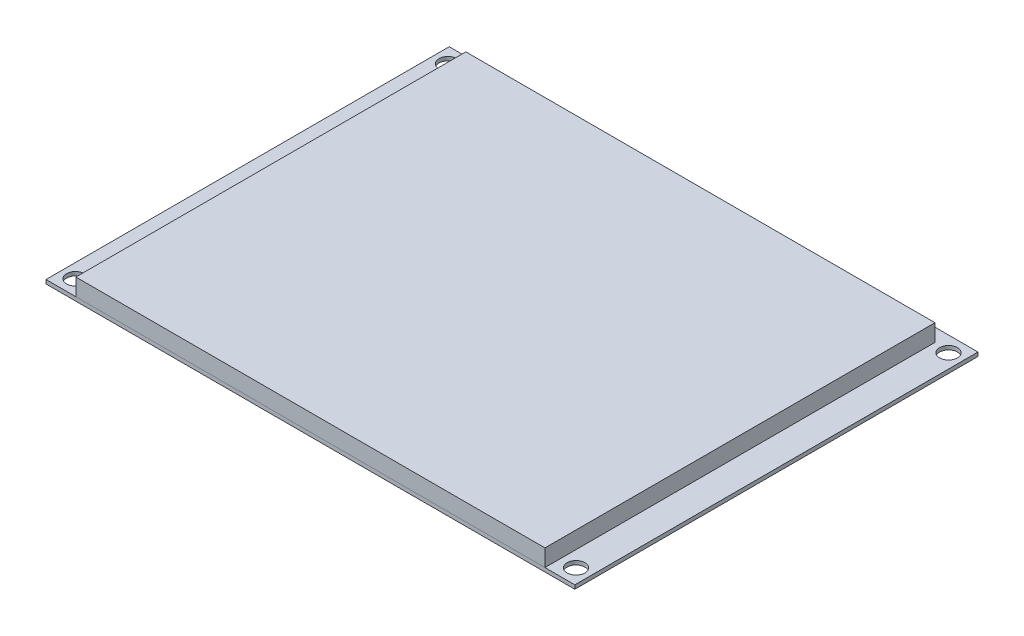
ISO-10303-21;
HEADER;
FILE_DESCRIPTION(('STEP AP214'),'2;1');
FILE_NAME('part.step','',(''),(''),'','','');
FILE_SCHEMA(('AUTOMOTIVE_DESIGN { 1 0 10303 214 1 1 1 1 }'));
ENDSEC;
DATA;
#1=APPLICATION_CONTEXT('core data for automotive mechanical design processes');
#2=APPLICATION_PROTOCOL_DEFINITION('international standard','automotive_design',2000,#1);
#3=PRODUCT_CONTEXT('',#1,'mechanical');
#4=PRODUCT('Part','Part','',(#3));
#5=PRODUCT_RELATED_PRODUCT_CATEGORY('part','',(#4));
#6=PRODUCT_DEFINITION_FORMATION('','',#4);
#7=PRODUCT_DEFINITION_CONTEXT('part definition',#1,'design');
#8=PRODUCT_DEFINITION('design','',#6,#7);
#9=PRODUCT_DEFINITION_SHAPE('','',#8);
#10=(LENGTH_UNIT() NAMED_UNIT(*) SI_UNIT(.MILLI.,.METRE.));
#11=(NAMED_UNIT(*) PLANE_ANGLE_UNIT() SI_UNIT($,.RADIAN.));
#12=(NAMED_UNIT(*) SI_UNIT($,.STERADIAN.) SOLID_ANGLE_UNIT());
#13=UNCERTAINTY_MEASURE_WITH_UNIT(LENGTH_MEASURE(1.E-05),#10,'distance_accuracy_value','');
#14=(GEOMETRIC_REPRESENTATION_CONTEXT(3) GLOBAL_UNCERTAINTY_ASSIGNED_CONTEXT((#13)) GLOBAL_UNIT_ASSIGNED_CONTEXT((#10,
#11,#12)) REPRESENTATION_CONTEXT('',''));
#15=CARTESIAN_POINT('',(0.,0.,0.));
#16=DIRECTION('',(0.,0.,1.));
#17=DIRECTION('',(1.,0.,0.));
#18=AXIS2_PLACEMENT_3D('',#15,#16,#17);
#19=CARTESIAN_POINT('',(-13.843,-2.159,-7.493));
#20=DIRECTION('',(1.,0.,0.));
#21=DIRECTION('',(0.,0.,-1.));
#22=AXIS2_PLACEMENT_3D('',#19,#20,#21);
#23=PLANE('',#22);
#24=DIRECTION('',(0.,0.,-1.));
#25=VECTOR('',#24,1.);
#26=CARTESIAN_POINT('',(-13.843,0.,-7.493));
#27=LINE('',#26,#25);
#28=CARTESIAN_POINT('',(-13.843,0.,-7.493));
#29=VERTEX_POINT('',#28);
#30=CARTESIAN_POINT('',(-13.843,0.,-11.938));
#31=VERTEX_POINT('',#30);
#32=EDGE_CURVE('E106',#29,#31,#27,.T.);
#33=ORIENTED_EDGE('',*,*,#32,.T.);
#34=DIRECTION('',(0.,1.,0.));
#35=VECTOR('',#34,1.);
#36=CARTESIAN_POINT('',(-13.843,-2.159,-11.938));
#37=LINE('',#36,#35);
#38=CARTESIAN_POINT('',(-13.843,-2.159,-11.938));
#39=VERTEX_POINT('',#38);
#40=EDGE_CURVE('E12',#39,#31,#37,.T.);
#41=ORIENTED_EDGE('',*,*,#40,.F.);
#42=DIRECTION('',(0.,0.,-1.));
#43=VECTOR('',#42,1.);
#44=CARTESIAN_POINT('',(-13.843,-2.159,-7.493));
#45=LINE('',#44,#43);
#46=CARTESIAN_POINT('',(-13.843,-2.159,-7.493));
#47=VERTEX_POINT('',#46);
#48=EDGE_CURVE('E94',#47,#39,#45,.T.);
#49=ORIENTED_EDGE('',*,*,#48,.F.);
#50=DIRECTION('',(0.,1.,0.));
#51=VECTOR('',#50,1.);
#52=CARTESIAN_POINT('',(-13.843,-2.159,-7.493));
#53=LINE('',#52,#51);
#54=EDGE_CURVE('E102',#47,#29,#53,.T.);
#55=ORIENTED_EDGE('',*,*,#54,.T.);
#56=EDGE_LOOP('',(#33,#41,#49,#55));
#57=FACE_BOUND('',#56,.T.);
#58=ADVANCED_FACE('F43',(#57),#23,.F.);
#59=CARTESIAN_POINT('',(-13.843,-2.159,-11.938));
#60=DIRECTION('',(0.,0.,1.));
#61=DIRECTION('',(1.,0.,0.));
#62=AXIS2_PLACEMENT_3D('',#59,#60,#61);
#63=PLANE('',#62);
#64=DIRECTION('',(1.,0.,0.));
#65=VECTOR('',#64,1.);
#66=CARTESIAN_POINT('',(-13.843,0.,-11.938));
#67=LINE('',#66,#65);
#68=CARTESIAN_POINT('',(13.843,0.,-11.938));
#69=VERTEX_POINT('',#68);
#70=EDGE_CURVE('E98',#31,#69,#67,.T.);
#71=ORIENTED_EDGE('',*,*,#70,.T.);
#72=DIRECTION('',(0.,1.,0.));
#73=VECTOR('',#72,1.);
#74=CARTESIAN_POINT('',(13.843,-2.159,-11.938));
#75=LINE('',#74,#73);
#76=CARTESIAN_POINT('',(13.843,-2.159,-11.938));
#77=VERTEX_POINT('',#76);
#78=EDGE_CURVE('E51',#77,#69,#75,.T.);
#79=ORIENTED_EDGE('',*,*,#78,.F.);
#80=DIRECTION('',(1.,0.,0.));
#81=VECTOR('',#80,1.);
#82=CARTESIAN_POINT('',(-13.843,-2.159,-11.938));
#83=LINE('',#82,#81);
#84=EDGE_CURVE('E89',#39,#77,#83,.T.);
#85=ORIENTED_EDGE('',*,*,#84,.F.);
#86=ORIENTED_EDGE('',*,*,#40,.T.);
#87=EDGE_LOOP('',(#71,#79,#85,#86));
#88=FACE_BOUND('',#87,.T.);
#89=ADVANCED_FACE('F97',(#88),#63,.F.);
#90=CARTESIAN_POINT('',(13.843,-2.159,-7.493));
#91=DIRECTION('',(-1.,0.,0.));
#92=DIRECTION('',(0.,0.,1.));
#93=AXIS2_PLACEMENT_3D('',#90,#91,#92);
#94=PLANE('',#93);
#95=DIRECTION('',(0.,0.,1.));
#96=VECTOR('',#95,1.);
#97=CARTESIAN_POINT('',(13.843,0.,-7.493));
#98=LINE('',#97,#96);
#99=CARTESIAN_POINT('',(13.843,0.,-7.493));
#100=VERTEX_POINT('',#99);
#101=EDGE_CURVE('E76',#69,#100,#98,.T.);
#102=ORIENTED_EDGE('',*,*,#101,.T.);
#103=DIRECTION('',(0.,1.,0.));
#104=VECTOR('',#103,1.);
#105=CARTESIAN_POINT('',(13.843,-2.159,-7.493));
#106=LINE('',#105,#104);
#107=CARTESIAN_POINT('',(13.843,-2.159,-7.493));
#108=VERTEX_POINT('',#107);
#109=EDGE_CURVE('E99',#108,#100,#106,.T.);
#110=ORIENTED_EDGE('',*,*,#109,.F.);
#111=DIRECTION('',(0.,0.,1.));
#112=VECTOR('',#111,1.);
#113=CARTESIAN_POINT('',(13.843,-2.159,-7.493));
#114=LINE('',#113,#112);
#115=EDGE_CURVE('E92',#77,#108,#114,.T.);
#116=ORIENTED_EDGE('',*,*,#115,.F.);
#117=ORIENTED_EDGE('',*,*,#78,.T.);
#118=EDGE_LOOP('',(#102,#110,#116,#117));
#119=FACE_BOUND('',#118,.T.);
#120=ADVANCED_FACE('F100',(#119),#94,.F.);
#121=CARTESIAN_POINT('',(-13.843,-2.159,-7.493));
#122=DIRECTION('',(0.,0.,-1.));
#123=DIRECTION('',(-1.,0.,0.));
#124=AXIS2_PLACEMENT_3D('',#121,#122,#123);
#125=PLANE('',#124);
#126=DIRECTION('',(-1.,0.,0.));
#127=VECTOR('',#126,1.);
#128=CARTESIAN_POINT('',(-13.843,0.,-7.493));
#129=LINE('',#128,#127);
#130=EDGE_CURVE('E82',#100,#29,#129,.T.);
#131=ORIENTED_EDGE('',*,*,#130,.T.);
#132=ORIENTED_EDGE('',*,*,#54,.F.);
#133=DIRECTION('',(-1.,0.,0.));
#134=VECTOR('',#133,1.);
#135=CARTESIAN_POINT('',(-13.843,-2.159,-7.493));
#136=LINE('',#135,#134);
#137=EDGE_CURVE('E59',#108,#47,#136,.T.);
#138=ORIENTED_EDGE('',*,*,#137,.F.);
#139=ORIENTED_EDGE('',*,*,#109,.T.);
#140=EDGE_LOOP('',(#131,#132,#138,#139));
#141=FACE_BOUND('',#140,.T.);
#142=ADVANCED_FACE('F113',(#141),#125,.F.);
#143=CARTESIAN_POINT('',(0.,-2.159,0.));
#144=DIRECTION('',(0.,-1.,0.));
#145=DIRECTION('',(0.,0.,-1.));
#146=AXIS2_PLACEMENT_3D('',#143,#144,#145);
#147=PLANE('',#146);
#148=ORIENTED_EDGE('',*,*,#48,.T.);
#149=ORIENTED_EDGE('',*,*,#84,.T.);
#150=ORIENTED_EDGE('',*,*,#115,.T.);
#151=ORIENTED_EDGE('',*,*,#137,.T.);
#152=EDGE_LOOP('',(#148,#149,#150,#151));
#153=FACE_BOUND('',#152,.T.);
#154=ADVANCED_FACE('F90',(#153),#147,.T.);
#155=CARTESIAN_POINT('',(0.,0.,0.));
#156=DIRECTION('',(0.,-1.,0.));
#157=DIRECTION('',(0.,0.,-1.));
#158=AXIS2_PLACEMENT_3D('',#155,#156,#157);
#159=PLANE('',#158);
#160=ORIENTED_EDGE('',*,*,#32,.F.);
#161=ORIENTED_EDGE('',*,*,#130,.F.);
#162=ORIENTED_EDGE('',*,*,#101,.F.);
#163=ORIENTED_EDGE('',*,*,#70,.F.);
#164=EDGE_LOOP('',(#160,#161,#162,#163));
#165=FACE_BOUND('',#164,.T.);
#166=ADVANCED_FACE('F116',(#165),#159,.F.);
#167=CLOSED_SHELL('',(#58,#89,#120,#142,#154,#166));
#168=MANIFOLD_SOLID_BREP('B2',#167);
#169=CARTESIAN_POINT('',(-38.4175,3.429,33.02));
#170=DIRECTION('',(1.,0.,0.));
#171=DIRECTION('',(0.,0.,-1.));
#172=AXIS2_PLACEMENT_3D('',#169,#170,#171);
#173=PLANE('',#172);
#174=DIRECTION('',(0.,0.,1.));
#175=VECTOR('',#174,1.);
#176=CARTESIAN_POINT('',(-38.4175,0.635,33.02));
#177=LINE('',#176,#175);
#178=CARTESIAN_POINT('',(-38.4175,0.635,-30.861));
#179=VERTEX_POINT('',#178);
#180=CARTESIAN_POINT('',(-38.4175,0.635,33.02));
#181=VERTEX_POINT('',#180);
#182=EDGE_CURVE('E238',#179,#181,#177,.T.);
#183=ORIENTED_EDGE('',*,*,#182,.T.);
#184=DIRECTION('',(0.,-1.,0.));
#185=VECTOR('',#184,1.);
#186=CARTESIAN_POINT('',(-38.4175,3.429,33.02));
#187=LINE('',#186,#185);
#188=CARTESIAN_POINT('',(-38.4175,3.429,33.02));
#189=VERTEX_POINT('',#188);
#190=EDGE_CURVE('E41',#189,#181,#187,.T.);
#191=ORIENTED_EDGE('',*,*,#190,.F.);
#192=DIRECTION('',(0.,0.,1.));
#193=VECTOR('',#192,1.);
#194=CARTESIAN_POINT('',(-38.4175,3.429,33.02));
#195=LINE('',#194,#193);
#196=CARTESIAN_POINT('',(-38.4175,3.429,-30.861));
#197=VERTEX_POINT('',#196);
#198=EDGE_CURVE('E226',#197,#189,#195,.T.);
#199=ORIENTED_EDGE('',*,*,#198,.F.);
#200=DIRECTION('',(0.,-1.,0.));
#201=VECTOR('',#200,1.);
#202=CARTESIAN_POINT('',(-38.4175,3.429,-30.861));
#203=LINE('',#202,#201);
#204=EDGE_CURVE('E234',#197,#179,#203,.T.);
#205=ORIENTED_EDGE('',*,*,#204,.T.);
#206=EDGE_LOOP('',(#183,#191,#199,#205));
#207=FACE_BOUND('',#206,.T.);
#208=ADVANCED_FACE('F175',(#207),#173,.F.);
#209=CARTESIAN_POINT('',(-38.4175,3.429,33.02));
#210=DIRECTION('',(0.,0.,-1.));
#211=DIRECTION('',(-1.,0.,0.));
#212=AXIS2_PLACEMENT_3D('',#209,#210,#211);
#213=PLANE('',#212);
#214=DIRECTION('',(1.,0.,0.));
#215=VECTOR('',#214,1.);
#216=CARTESIAN_POINT('',(-38.4175,0.635,33.02));
#217=LINE('',#216,#215);
#218=CARTESIAN_POINT('',(38.4175,0.635,33.02));
#219=VERTEX_POINT('',#218);
#220=EDGE_CURVE('E230',#181,#219,#217,.T.);
#221=ORIENTED_EDGE('',*,*,#220,.T.);
#222=DIRECTION('',(0.,-1.,0.));
#223=VECTOR('',#222,1.);
#224=CARTESIAN_POINT('',(38.4175,3.429,33.02));
#225=LINE('',#224,#223);
#226=CARTESIAN_POINT('',(38.4175,3.429,33.02));
#227=VERTEX_POINT('',#226);
#228=EDGE_CURVE('E183',#227,#219,#225,.T.);
#229=ORIENTED_EDGE('',*,*,#228,.F.);
#230=DIRECTION('',(1.,0.,0.));
#231=VECTOR('',#230,1.);
#232=CARTESIAN_POINT('',(-38.4175,3.429,33.02));
#233=LINE('',#232,#231);
#234=EDGE_CURVE('E221',#189,#227,#233,.T.);
#235=ORIENTED_EDGE('',*,*,#234,.F.);
#236=ORIENTED_EDGE('',*,*,#190,.T.);
#237=EDGE_LOOP('',(#221,#229,#235,#236));
#238=FACE_BOUND('',#237,.T.);
#239=ADVANCED_FACE('F229',(#238),#213,.F.);
#240=CARTESIAN_POINT('',(38.4175,3.429,33.02));
#241=DIRECTION('',(-1.,0.,0.));
#242=DIRECTION('',(0.,0.,1.));
#243=AXIS2_PLACEMENT_3D('',#240,#241,#242);
#244=PLANE('',#243);
#245=DIRECTION('',(0.,0.,-1.));
#246=VECTOR('',#245,1.);
#247=CARTESIAN_POINT('',(38.4175,0.635,33.02));
#248=LINE('',#247,#246);
#249=CARTESIAN_POINT('',(38.4175,0.635,-30.861));
#250=VERTEX_POINT('',#249);
#251=EDGE_CURVE('E208',#219,#250,#248,.T.);
#252=ORIENTED_EDGE('',*,*,#251,.T.);
#253=DIRECTION('',(0.,-1.,0.));
#254=VECTOR('',#253,1.);
#255=CARTESIAN_POINT('',(38.4175,3.429,-30.861));
#256=LINE('',#255,#254);
#257=CARTESIAN_POINT('',(38.4175,3.429,-30.861));
#258=VERTEX_POINT('',#257);
#259=EDGE_CURVE('E231',#258,#250,#256,.T.);
#260=ORIENTED_EDGE('',*,*,#259,.F.);
#261=DIRECTION('',(0.,0.,-1.));
#262=VECTOR('',#261,1.);
#263=CARTESIAN_POINT('',(38.4175,3.429,33.02));
#264=LINE('',#263,#262);
#265=EDGE_CURVE('E224',#227,#258,#264,.T.);
#266=ORIENTED_EDGE('',*,*,#265,.F.);
#267=ORIENTED_EDGE('',*,*,#228,.T.);
#268=EDGE_LOOP('',(#252,#260,#266,#267));
#269=FACE_BOUND('',#268,.T.);
#270=ADVANCED_FACE('F232',(#269),#244,.F.);
#271=CARTESIAN_POINT('',(-38.4175,3.429,-30.861));
#272=DIRECTION('',(0.,0.,1.));
#273=DIRECTION('',(1.,0.,0.));
#274=AXIS2_PLACEMENT_3D('',#271,#272,#273);
#275=PLANE('',#274);
#276=DIRECTION('',(-1.,0.,0.));
#277=VECTOR('',#276,1.);
#278=CARTESIAN_POINT('',(-38.4175,0.635,-30.861));
#279=LINE('',#278,#277);
#280=EDGE_CURVE('E214',#250,#179,#279,.T.);
#281=ORIENTED_EDGE('',*,*,#280,.T.);
#282=ORIENTED_EDGE('',*,*,#204,.F.);
#283=DIRECTION('',(-1.,0.,0.));
#284=VECTOR('',#283,1.);
#285=CARTESIAN_POINT('',(-38.4175,3.429,-30.861));
#286=LINE('',#285,#284);
#287=EDGE_CURVE('E191',#258,#197,#286,.T.);
#288=ORIENTED_EDGE('',*,*,#287,.F.);
#289=ORIENTED_EDGE('',*,*,#259,.T.);
#290=EDGE_LOOP('',(#281,#282,#288,#289));
#291=FACE_BOUND('',#290,.T.);
#292=ADVANCED_FACE('F245',(#291),#275,.F.);
#293=CARTESIAN_POINT('',(0.,3.429,0.));
#294=DIRECTION('',(0.,-1.,0.));
#295=DIRECTION('',(0.,0.,-1.));
#296=AXIS2_PLACEMENT_3D('',#293,#294,#295);
#297=PLANE('',#296);
#298=ORIENTED_EDGE('',*,*,#198,.T.);
#299=ORIENTED_EDGE('',*,*,#234,.T.);
#300=ORIENTED_EDGE('',*,*,#265,.T.);
#301=ORIENTED_EDGE('',*,*,#287,.T.);
#302=EDGE_LOOP('',(#298,#299,#300,#301));
#303=FACE_BOUND('',#302,.T.);
#304=ADVANCED_FACE('F222',(#303),#297,.F.);
#305=CARTESIAN_POINT('',(0.,0.635,0.));
#306=DIRECTION('',(0.,-1.,0.));
#307=DIRECTION('',(0.,0.,-1.));
#308=AXIS2_PLACEMENT_3D('',#305,#306,#307);
#309=PLANE('',#308);
#310=ORIENTED_EDGE('',*,*,#182,.F.);
#311=ORIENTED_EDGE('',*,*,#280,.F.);
#312=ORIENTED_EDGE('',*,*,#251,.F.);
#313=ORIENTED_EDGE('',*,*,#220,.F.);
#314=EDGE_LOOP('',(#310,#311,#312,#313));
#315=FACE_BOUND('',#314,.T.);
#316=ADVANCED_FACE('F248',(#315),#309,.T.);
#317=CLOSED_SHELL('',(#208,#239,#270,#292,#304,#316));
#318=MANIFOLD_SOLID_BREP('B6',#317);
#319=CARTESIAN_POINT('',(-43.307,0.635,-33.02));
#320=DIRECTION('',(0.,0.,1.));
#321=DIRECTION('',(1.,0.,0.));
#322=AXIS2_PLACEMENT_3D('',#319,#320,#321);
#323=PLANE('',#322);
#324=DIRECTION('',(-1.,0.,0.));
#325=VECTOR('',#324,1.);
#326=CARTESIAN_POINT('',(-43.307,0.,-33.02));
#327=LINE('',#326,#325);
#328=CARTESIAN_POINT('',(43.307,0.,-33.02));
#329=VERTEX_POINT('',#328);
#330=CARTESIAN_POINT('',(23.749,0.,-33.02));
#331=VERTEX_POINT('',#330);
#332=EDGE_CURVE('E392',#329,#331,#327,.T.);
#333=ORIENTED_EDGE('',*,*,#332,.T.);
#334=DIRECTION('',(0.,-1.,0.));
#335=VECTOR('',#334,1.);
#336=CARTESIAN_POINT('',(23.749,48.3775416164661,-33.02));
#337=LINE('',#336,#335);
#338=CARTESIAN_POINT('',(23.749,0.635000000000011,-33.02));
#339=VERTEX_POINT('',#338);
#340=EDGE_CURVE('E380',#339,#331,#337,.T.);
#341=ORIENTED_EDGE('',*,*,#340,.F.);
#342=DIRECTION('',(-1.,0.,0.));
#343=VECTOR('',#342,1.);
#344=CARTESIAN_POINT('',(-43.307,0.635,-33.02));
#345=LINE('',#344,#343);
#346=CARTESIAN_POINT('',(43.307,0.635,-33.02));
#347=VERTEX_POINT('',#346);
#348=EDGE_CURVE('E390',#347,#339,#345,.T.);
#349=ORIENTED_EDGE('',*,*,#348,.F.);
#350=DIRECTION('',(0.,-1.,0.));
#351=VECTOR('',#350,1.);
#352=CARTESIAN_POINT('',(43.307,0.635,-33.02));
#353=LINE('',#352,#351);
#354=EDGE_CURVE('E400',#347,#329,#353,.T.);
#355=ORIENTED_EDGE('',*,*,#354,.T.);
#356=EDGE_LOOP('',(#333,#341,#349,#355));
#357=FACE_BOUND('',#356,.T.);
#358=ADVANCED_FACE('F298',(#357),#323,.F.);
#359=CARTESIAN_POINT('',(-43.307,0.635,-33.02));
#360=DIRECTION('',(1.,0.,0.));
#361=DIRECTION('',(0.,0.,-1.));
#362=AXIS2_PLACEMENT_3D('',#359,#360,#361);
#363=PLANE('',#362);
#364=DIRECTION('',(0.,0.,1.));
#365=VECTOR('',#364,1.);
#366=CARTESIAN_POINT('',(-43.307,0.,-33.02));
#367=LINE('',#366,#365);
#368=CARTESIAN_POINT('',(-43.307,0.,-33.02));
#369=VERTEX_POINT('',#368);
#370=CARTESIAN_POINT('',(-43.307,0.,33.02));
#371=VERTEX_POINT('',#370);
#372=EDGE_CURVE('E405',#369,#371,#367,.T.);
#373=ORIENTED_EDGE('',*,*,#372,.T.);
#374=DIRECTION('',(0.,-1.,0.));
#375=VECTOR('',#374,1.);
#376=CARTESIAN_POINT('',(-43.307,0.635,33.02));
#377=LINE('',#376,#375);
#378=CARTESIAN_POINT('',(-43.307,0.635,33.02));
#379=VERTEX_POINT('',#378);
#380=EDGE_CURVE('E173',#379,#371,#377,.T.);
#381=ORIENTED_EDGE('',*,*,#380,.F.);
#382=DIRECTION('',(0.,0.,1.));
#383=VECTOR('',#382,1.);
#384=CARTESIAN_POINT('',(-43.307,0.635,-33.02));
#385=LINE('',#384,#383);
#386=CARTESIAN_POINT('',(-43.307,0.635,-33.02));
#387=VERTEX_POINT('',#386);
#388=EDGE_CURVE('E413',#387,#379,#385,.T.);
#389=ORIENTED_EDGE('',*,*,#388,.F.);
#390=DIRECTION('',(0.,-1.,0.));
#391=VECTOR('',#390,1.);
#392=CARTESIAN_POINT('',(-43.307,0.635,-33.02));
#393=LINE('',#392,#391);
#394=EDGE_CURVE('E398',#387,#369,#393,.T.);
#395=ORIENTED_EDGE('',*,*,#394,.T.);
#396=EDGE_LOOP('',(#373,#381,#389,#395));
#397=FACE_BOUND('',#396,.T.);
#398=ADVANCED_FACE('F300',(#397),#363,.F.);
#399=CARTESIAN_POINT('',(-43.307,0.635,33.02));
#400=DIRECTION('',(0.,0.,-1.));
#401=DIRECTION('',(-1.,0.,0.));
#402=AXIS2_PLACEMENT_3D('',#399,#400,#401);
#403=PLANE('',#402);
#404=DIRECTION('',(1.,0.,0.));
#405=VECTOR('',#404,1.);
#406=CARTESIAN_POINT('',(-43.307,0.,33.02));
#407=LINE('',#406,#405);
#408=CARTESIAN_POINT('',(43.307,0.,33.02));
#409=VERTEX_POINT('',#408);
#410=EDGE_CURVE('E408',#371,#409,#407,.T.);
#411=ORIENTED_EDGE('',*,*,#410,.T.);
#412=DIRECTION('',(0.,-1.,0.));
#413=VECTOR('',#412,1.);
#414=CARTESIAN_POINT('',(43.307,0.635,33.02));
#415=LINE('',#414,#413);
#416=CARTESIAN_POINT('',(43.307,0.635,33.02));
#417=VERTEX_POINT('',#416);
#418=EDGE_CURVE('E307',#417,#409,#415,.T.);
#419=ORIENTED_EDGE('',*,*,#418,.F.);
#420=DIRECTION('',(1.,0.,0.));
#421=VECTOR('',#420,1.);
#422=CARTESIAN_POINT('',(-43.307,0.635,33.02));
#423=LINE('',#422,#421);
#424=EDGE_CURVE('E353',#379,#417,#423,.T.);
#425=ORIENTED_EDGE('',*,*,#424,.F.);
#426=ORIENTED_EDGE('',*,*,#380,.T.);
#427=EDGE_LOOP('',(#411,#419,#425,#426));
#428=FACE_BOUND('',#427,.T.);
#429=ADVANCED_FACE('F458',(#428),#403,.F.);
#430=CARTESIAN_POINT('',(43.307,0.635,-33.02));
#431=DIRECTION('',(-1.,0.,0.));
#432=DIRECTION('',(0.,0.,1.));
#433=AXIS2_PLACEMENT_3D('',#430,#431,#432);
#434=PLANE('',#433);
#435=DIRECTION('',(0.,0.,-1.));
#436=VECTOR('',#435,1.);
#437=CARTESIAN_POINT('',(43.307,0.,-33.02));
#438=LINE('',#437,#436);
#439=EDGE_CURVE('E411',#409,#329,#438,.T.);
#440=ORIENTED_EDGE('',*,*,#439,.T.);
#441=ORIENTED_EDGE('',*,*,#354,.F.);
#442=DIRECTION('',(0.,0.,-1.));
#443=VECTOR('',#442,1.);
#444=CARTESIAN_POINT('',(43.307,0.635,-33.02));
#445=LINE('',#444,#443);
#446=EDGE_CURVE('E396',#417,#347,#445,.T.);
#447=ORIENTED_EDGE('',*,*,#446,.F.);
#448=ORIENTED_EDGE('',*,*,#418,.T.);
#449=EDGE_LOOP('',(#440,#441,#447,#448));
#450=FACE_BOUND('',#449,.T.);
#451=ADVANCED_FACE('F461',(#450),#434,.F.);
#452=CARTESIAN_POINT('',(-23.749,0.634999999999997,-33.02));
#453=VERTEX_POINT('',#452);
#454=EDGE_CURVE('E324',#453,#387,#345,.T.);
#455=ORIENTED_EDGE('',*,*,#454,.F.);
#456=DIRECTION('',(0.,-1.,0.));
#457=VECTOR('',#456,1.);
#458=CARTESIAN_POINT('',(-23.749,48.3775416164661,-33.02));
#459=LINE('',#458,#457);
#460=CARTESIAN_POINT('',(-23.749,0.,-33.02));
#461=VERTEX_POINT('',#460);
#462=EDGE_CURVE('E409',#453,#461,#459,.T.);
#463=ORIENTED_EDGE('',*,*,#462,.T.);
#464=EDGE_CURVE('E346',#461,#369,#327,.T.);
#465=ORIENTED_EDGE('',*,*,#464,.T.);
#466=ORIENTED_EDGE('',*,*,#394,.F.);
#467=EDGE_LOOP('',(#455,#463,#465,#466));
#468=FACE_BOUND('',#467,.T.);
#469=ADVANCED_FACE('F468',(#468),#323,.F.);
#470=CARTESIAN_POINT('',(0.,0.635,0.));
#471=DIRECTION('',(0.,1.,0.));
#472=DIRECTION('',(0.,0.,1.));
#473=AXIS2_PLACEMENT_3D('',#470,#471,#472);
#474=PLANE('',#473);
#475=CARTESIAN_POINT('',(40.9956,0.635,-30.5054));
#476=DIRECTION('',(0.,1.,0.));
#477=DIRECTION('',(0.,0.,1.));
#478=AXIS2_PLACEMENT_3D('',#475,#476,#477);
#479=CIRCLE('',#478,1.46050000000001);
#480=CARTESIAN_POINT('',(40.9956,0.635,-29.0449));
#481=VERTEX_POINT('',#480);
#482=EDGE_CURVE('E428',#481,#481,#479,.T.);
#483=ORIENTED_EDGE('',*,*,#482,.F.);
#484=EDGE_LOOP('',(#483));
#485=FACE_BOUND('',#484,.T.);
#486=CARTESIAN_POINT('',(40.9956,0.635,30.5054));
#487=DIRECTION('',(0.,1.,0.));
#488=DIRECTION('',(0.,0.,1.));
#489=AXIS2_PLACEMENT_3D('',#486,#487,#488);
#490=CIRCLE('',#489,1.46050000000001);
#491=CARTESIAN_POINT('',(40.9956,0.635,31.9659));
#492=VERTEX_POINT('',#491);
#493=EDGE_CURVE('E425',#492,#492,#490,.T.);
#494=ORIENTED_EDGE('',*,*,#493,.F.);
#495=EDGE_LOOP('',(#494));
#496=FACE_BOUND('',#495,.T.);
#497=CARTESIAN_POINT('',(-40.9956,0.635,30.5054));
#498=DIRECTION('',(0.,1.,0.));
#499=DIRECTION('',(0.,0.,1.));
#500=AXIS2_PLACEMENT_3D('',#497,#498,#499);
#501=CIRCLE('',#500,1.4605);
#502=CARTESIAN_POINT('',(-40.9956,0.635,31.9659));
#503=VERTEX_POINT('',#502);
#504=EDGE_CURVE('E422',#503,#503,#501,.T.);
#505=ORIENTED_EDGE('',*,*,#504,.F.);
#506=EDGE_LOOP('',(#505));
#507=FACE_BOUND('',#506,.T.);
#508=CARTESIAN_POINT('',(-40.9956,0.635,-30.5054));
#509=DIRECTION('',(0.,1.,0.));
#510=DIRECTION('',(0.,0.,1.));
#511=AXIS2_PLACEMENT_3D('',#508,#509,#510);
#512=CIRCLE('',#511,1.46050000000001);
#513=CARTESIAN_POINT('',(-40.9956,0.635,-29.0449));
#514=VERTEX_POINT('',#513);
#515=EDGE_CURVE('E421',#514,#514,#512,.T.);
#516=ORIENTED_EDGE('',*,*,#515,.F.);
#517=EDGE_LOOP('',(#516));
#518=FACE_BOUND('',#517,.T.);
#519=DIRECTION('',(0.,0.,1.));
#520=VECTOR('',#519,1.);
#521=CARTESIAN_POINT('',(23.749,0.634999999999997,-33.02));
#522=LINE('',#521,#520);
#523=CARTESIAN_POINT('',(23.749,0.634999999999997,-28.194));
#524=VERTEX_POINT('',#523);
#525=EDGE_CURVE('E376',#339,#524,#522,.T.);
#526=ORIENTED_EDGE('',*,*,#525,.T.);
#527=DIRECTION('',(-1.,0.,0.));
#528=VECTOR('',#527,1.);
#529=CARTESIAN_POINT('',(-23.749,0.634999999999997,-28.194));
#530=LINE('',#529,#528);
#531=CARTESIAN_POINT('',(-23.749,0.634999999999997,-28.194));
#532=VERTEX_POINT('',#531);
#533=EDGE_CURVE('E451',#524,#532,#530,.T.);
#534=ORIENTED_EDGE('',*,*,#533,.T.);
#535=DIRECTION('',(0.,0.,-1.));
#536=VECTOR('',#535,1.);
#537=CARTESIAN_POINT('',(-23.749,0.634999999999997,-33.02));
#538=LINE('',#537,#536);
#539=EDGE_CURVE('E448',#532,#453,#538,.T.);
#540=ORIENTED_EDGE('',*,*,#539,.T.);
#541=ORIENTED_EDGE('',*,*,#454,.T.);
#542=ORIENTED_EDGE('',*,*,#388,.T.);
#543=ORIENTED_EDGE('',*,*,#424,.T.);
#544=ORIENTED_EDGE('',*,*,#446,.T.);
#545=ORIENTED_EDGE('',*,*,#348,.T.);
#546=EDGE_LOOP('',(#526,#534,#540,#541,#542,#543,#544,#545));
#547=FACE_BOUND('',#546,.T.);
#548=ADVANCED_FACE('F394',(#485,#496,#507,#518,#547),#474,.T.);
#549=CARTESIAN_POINT('',(0.,0.,0.));
#550=DIRECTION('',(0.,1.,0.));
#551=DIRECTION('',(0.,0.,1.));
#552=AXIS2_PLACEMENT_3D('',#549,#550,#551);
#553=PLANE('',#552);
#554=CARTESIAN_POINT('',(40.9956,0.,-30.5054));
#555=DIRECTION('',(0.,1.,0.));
#556=DIRECTION('',(0.,0.,1.));
#557=AXIS2_PLACEMENT_3D('',#554,#555,#556);
#558=CIRCLE('',#557,1.46050000000001);
#559=CARTESIAN_POINT('',(40.9956,0.,-29.0449));
#560=VERTEX_POINT('',#559);
#561=EDGE_CURVE('E302',#560,#560,#558,.T.);
#562=ORIENTED_EDGE('',*,*,#561,.T.);
#563=EDGE_LOOP('',(#562));
#564=FACE_BOUND('',#563,.T.);
#565=CARTESIAN_POINT('',(40.9956,0.,30.5054));
#566=DIRECTION('',(0.,1.,0.));
#567=DIRECTION('',(0.,0.,1.));
#568=AXIS2_PLACEMENT_3D('',#565,#566,#567);
#569=CIRCLE('',#568,1.46050000000001);
#570=CARTESIAN_POINT('',(40.9956,0.,31.9659));
#571=VERTEX_POINT('',#570);
#572=EDGE_CURVE('E426',#571,#571,#569,.T.);
#573=ORIENTED_EDGE('',*,*,#572,.T.);
#574=EDGE_LOOP('',(#573));
#575=FACE_BOUND('',#574,.T.);
#576=CARTESIAN_POINT('',(-40.9956,0.,30.5054));
#577=DIRECTION('',(0.,1.,0.));
#578=DIRECTION('',(0.,0.,1.));
#579=AXIS2_PLACEMENT_3D('',#576,#577,#578);
#580=CIRCLE('',#579,1.4605);
#581=CARTESIAN_POINT('',(-40.9956,0.,31.9659));
#582=VERTEX_POINT('',#581);
#583=EDGE_CURVE('E423',#582,#582,#580,.T.);
#584=ORIENTED_EDGE('',*,*,#583,.T.);
#585=EDGE_LOOP('',(#584));
#586=FACE_BOUND('',#585,.T.);
#587=CARTESIAN_POINT('',(-40.9956,0.,-30.5054));
#588=DIRECTION('',(0.,1.,0.));
#589=DIRECTION('',(0.,0.,1.));
#590=AXIS2_PLACEMENT_3D('',#587,#588,#589);
#591=CIRCLE('',#590,1.46050000000001);
#592=CARTESIAN_POINT('',(-40.9956,0.,-29.0449));
#593=VERTEX_POINT('',#592);
#594=EDGE_CURVE('E418',#593,#593,#591,.T.);
#595=ORIENTED_EDGE('',*,*,#594,.T.);
#596=EDGE_LOOP('',(#595));
#597=FACE_BOUND('',#596,.T.);
#598=DIRECTION('',(-1.,0.,0.));
#599=VECTOR('',#598,1.);
#600=CARTESIAN_POINT('',(-23.749,0.,-28.194));
#601=LINE('',#600,#599);
#602=CARTESIAN_POINT('',(23.749,0.,-28.194));
#603=VERTEX_POINT('',#602);
#604=CARTESIAN_POINT('',(-23.749,0.,-28.194));
#605=VERTEX_POINT('',#604);
#606=EDGE_CURVE('E315',#603,#605,#601,.T.);
#607=ORIENTED_EDGE('',*,*,#606,.F.);
#608=DIRECTION('',(0.,0.,1.));
#609=VECTOR('',#608,1.);
#610=CARTESIAN_POINT('',(23.749,0.,-33.02));
#611=LINE('',#610,#609);
#612=EDGE_CURVE('E445',#331,#603,#611,.T.);
#613=ORIENTED_EDGE('',*,*,#612,.F.);
#614=ORIENTED_EDGE('',*,*,#332,.F.);
#615=ORIENTED_EDGE('',*,*,#439,.F.);
#616=ORIENTED_EDGE('',*,*,#410,.F.);
#617=ORIENTED_EDGE('',*,*,#372,.F.);
#618=ORIENTED_EDGE('',*,*,#464,.F.);
#619=DIRECTION('',(0.,0.,-1.));
#620=VECTOR('',#619,1.);
#621=CARTESIAN_POINT('',(-23.749,0.,-33.02));
#622=LINE('',#621,#620);
#623=EDGE_CURVE('E443',#605,#461,#622,.T.);
#624=ORIENTED_EDGE('',*,*,#623,.F.);
#625=EDGE_LOOP('',(#607,#613,#614,#615,#616,#617,#618,#624));
#626=FACE_BOUND('',#625,.T.);
#627=ADVANCED_FACE('F463',(#564,#575,#586,#597,#626),#553,.F.);
#628=CARTESIAN_POINT('',(23.749,48.3775416164661,-33.02));
#629=DIRECTION('',(1.,0.,0.));
#630=DIRECTION('',(0.,0.,-1.));
#631=AXIS2_PLACEMENT_3D('',#628,#629,#630);
#632=PLANE('',#631);
#633=ORIENTED_EDGE('',*,*,#340,.T.);
#634=ORIENTED_EDGE('',*,*,#612,.T.);
#635=DIRECTION('',(0.,-1.,0.));
#636=VECTOR('',#635,1.);
#637=CARTESIAN_POINT('',(23.749,48.3775416164661,-28.194));
#638=LINE('',#637,#636);
#639=EDGE_CURVE('E382',#524,#603,#638,.T.);
#640=ORIENTED_EDGE('',*,*,#639,.F.);
#641=ORIENTED_EDGE('',*,*,#525,.F.);
#642=EDGE_LOOP('',(#633,#634,#640,#641));
#643=FACE_BOUND('',#642,.T.);
#644=ADVANCED_FACE('F378',(#643),#632,.F.);
#645=CARTESIAN_POINT('',(-23.749,48.3775416164661,-28.194));
#646=DIRECTION('',(0.,0.,1.));
#647=DIRECTION('',(1.,0.,0.));
#648=AXIS2_PLACEMENT_3D('',#645,#646,#647);
#649=PLANE('',#648);
#650=ORIENTED_EDGE('',*,*,#639,.T.);
#651=ORIENTED_EDGE('',*,*,#606,.T.);
#652=DIRECTION('',(0.,-1.,0.));
#653=VECTOR('',#652,1.);
#654=CARTESIAN_POINT('',(-23.749,48.3775416164661,-28.194));
#655=LINE('',#654,#653);
#656=EDGE_CURVE('E450',#532,#605,#655,.T.);
#657=ORIENTED_EDGE('',*,*,#656,.F.);
#658=ORIENTED_EDGE('',*,*,#533,.F.);
#659=EDGE_LOOP('',(#650,#651,#657,#658));
#660=FACE_BOUND('',#659,.T.);
#661=ADVANCED_FACE('F531',(#660),#649,.F.);
#662=CARTESIAN_POINT('',(-23.749,48.3775416164661,-33.02));
#663=DIRECTION('',(-1.,0.,0.));
#664=DIRECTION('',(0.,0.,1.));
#665=AXIS2_PLACEMENT_3D('',#662,#663,#664);
#666=PLANE('',#665);
#667=ORIENTED_EDGE('',*,*,#656,.T.);
#668=ORIENTED_EDGE('',*,*,#623,.T.);
#669=ORIENTED_EDGE('',*,*,#462,.F.);
#670=ORIENTED_EDGE('',*,*,#539,.F.);
#671=EDGE_LOOP('',(#667,#668,#669,#670));
#672=FACE_BOUND('',#671,.T.);
#673=ADVANCED_FACE('F467',(#672),#666,.F.);
#674=CARTESIAN_POINT('',(-40.9956,-2.159,-30.5054));
#675=DIRECTION('',(0.,1.,0.));
#676=DIRECTION('',(0.,0.,1.));
#677=AXIS2_PLACEMENT_3D('',#674,#675,#676);
#678=CYLINDRICAL_SURFACE('',#677,1.46050000000001);
#679=ORIENTED_EDGE('',*,*,#515,.T.);
#680=EDGE_LOOP('',(#679));
#681=FACE_BOUND('',#680,.T.);
#682=ORIENTED_EDGE('',*,*,#594,.F.);
#683=EDGE_LOOP('',(#682));
#684=FACE_BOUND('',#683,.T.);
#685=ADVANCED_FACE('F545',(#681,#684),#678,.F.);
#686=CARTESIAN_POINT('',(-40.9956,-2.159,30.5054));
#687=DIRECTION('',(0.,1.,0.));
#688=DIRECTION('',(0.,0.,1.));
#689=AXIS2_PLACEMENT_3D('',#686,#687,#688);
#690=CYLINDRICAL_SURFACE('',#689,1.4605);
#691=ORIENTED_EDGE('',*,*,#504,.T.);
#692=EDGE_LOOP('',(#691));
#693=FACE_BOUND('',#692,.T.);
#694=ORIENTED_EDGE('',*,*,#583,.F.);
#695=EDGE_LOOP('',(#694));
#696=FACE_BOUND('',#695,.T.);
#697=ADVANCED_FACE('F552',(#693,#696),#690,.F.);
#698=CARTESIAN_POINT('',(40.9956,-2.159,30.5054));
#699=DIRECTION('',(0.,1.,0.));
#700=DIRECTION('',(0.,0.,1.));
#701=AXIS2_PLACEMENT_3D('',#698,#699,#700);
#702=CYLINDRICAL_SURFACE('',#701,1.46050000000001);
#703=ORIENTED_EDGE('',*,*,#493,.T.);
#704=EDGE_LOOP('',(#703));
#705=FACE_BOUND('',#704,.T.);
#706=ORIENTED_EDGE('',*,*,#572,.F.);
#707=EDGE_LOOP('',(#706));
#708=FACE_BOUND('',#707,.T.);
#709=ADVANCED_FACE('F561',(#705,#708),#702,.F.);
#710=CARTESIAN_POINT('',(40.9956,-2.159,-30.5054));
#711=DIRECTION('',(0.,1.,0.));
#712=DIRECTION('',(0.,0.,1.));
#713=AXIS2_PLACEMENT_3D('',#710,#711,#712);
#714=CYLINDRICAL_SURFACE('',#713,1.46050000000001);
#715=ORIENTED_EDGE('',*,*,#482,.T.);
#716=EDGE_LOOP('',(#715));
#717=FACE_BOUND('',#716,.T.);
#718=ORIENTED_EDGE('',*,*,#561,.F.);
#719=EDGE_LOOP('',(#718));
#720=FACE_BOUND('',#719,.T.);
#721=ADVANCED_FACE('F570',(#717,#720),#714,.F.);
#722=CLOSED_SHELL('',(#358,#398,#429,#451,#469,#548,#627,#644,#661,#673,#685,#697,#709,#721));
#723=MANIFOLD_SOLID_BREP('B35',#722);
#724=ADVANCED_BREP_SHAPE_REPRESENTATION('',(#18,#168,#318,#723),#14);
#725=SHAPE_DEFINITION_REPRESENTATION(#9,#724);
ENDSEC;
END-ISO-10303-21;
